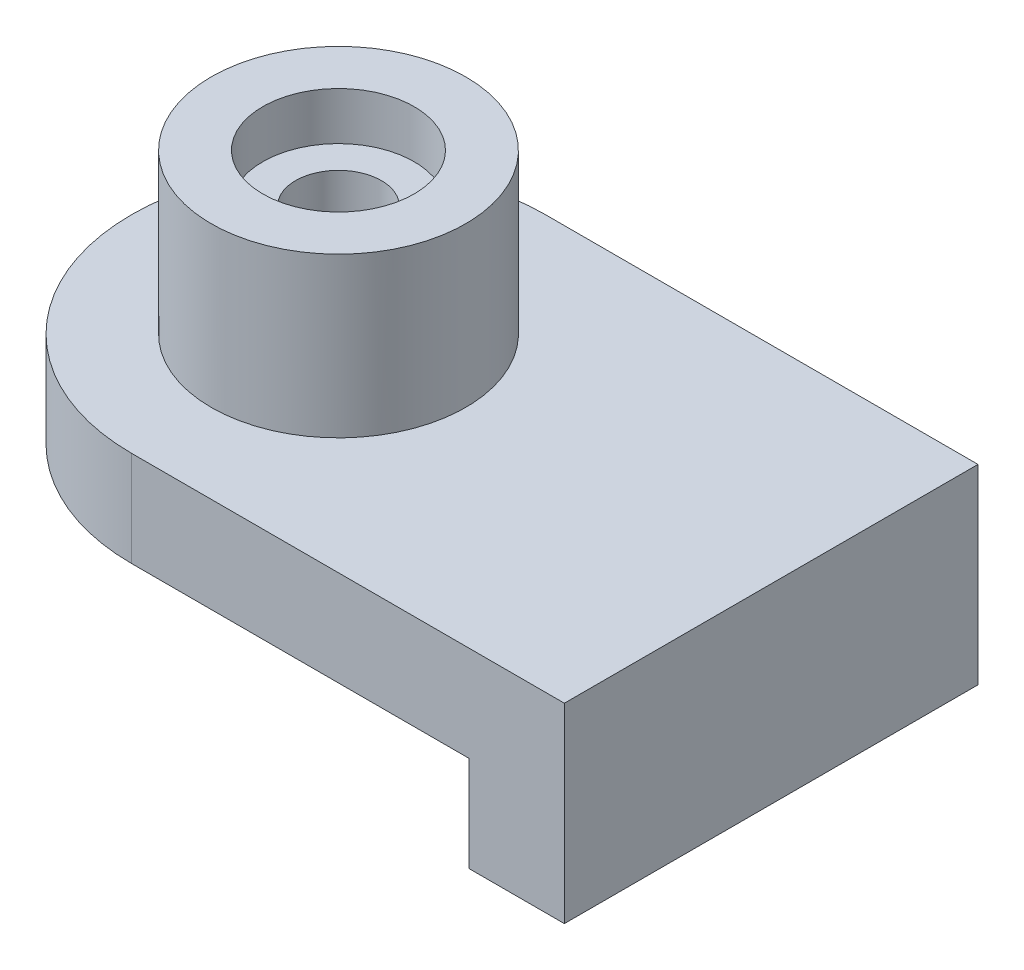
ISO-10303-21;
HEADER;
FILE_DESCRIPTION(('STEP AP214'),'2;1');
FILE_NAME('part.step','',(''),(''),'','','');
FILE_SCHEMA(('AUTOMOTIVE_DESIGN { 1 0 10303 214 1 1 1 1 }'));
ENDSEC;
DATA;
#1=APPLICATION_CONTEXT('core data for automotive mechanical design processes');
#2=APPLICATION_PROTOCOL_DEFINITION('international standard','automotive_design',2000,#1);
#3=PRODUCT_CONTEXT('',#1,'mechanical');
#4=PRODUCT('Part','Part','',(#3));
#5=PRODUCT_RELATED_PRODUCT_CATEGORY('part','',(#4));
#6=PRODUCT_DEFINITION_FORMATION('','',#4);
#7=PRODUCT_DEFINITION_CONTEXT('part definition',#1,'design');
#8=PRODUCT_DEFINITION('design','',#6,#7);
#9=PRODUCT_DEFINITION_SHAPE('','',#8);
#10=(LENGTH_UNIT() NAMED_UNIT(*) SI_UNIT(.MILLI.,.METRE.));
#11=(NAMED_UNIT(*) PLANE_ANGLE_UNIT() SI_UNIT($,.RADIAN.));
#12=(NAMED_UNIT(*) SI_UNIT($,.STERADIAN.) SOLID_ANGLE_UNIT());
#13=UNCERTAINTY_MEASURE_WITH_UNIT(LENGTH_MEASURE(1.E-05),#10,'distance_accuracy_value','');
#14=(GEOMETRIC_REPRESENTATION_CONTEXT(3) GLOBAL_UNCERTAINTY_ASSIGNED_CONTEXT((#13)) GLOBAL_UNIT_ASSIGNED_CONTEXT((#10,
#11,#12)) REPRESENTATION_CONTEXT('',''));
#15=CARTESIAN_POINT('',(0.,0.,0.));
#16=DIRECTION('',(0.,0.,1.));
#17=DIRECTION('',(1.,0.,0.));
#18=AXIS2_PLACEMENT_3D('',#15,#16,#17);
#19=CARTESIAN_POINT('',(53.,0.,65.));
#20=DIRECTION('',(0.,1.,0.));
#21=DIRECTION('',(-1.,0.,0.));
#22=AXIS2_PLACEMENT_3D('',#19,#20,#21);
#23=PLANE('',#22);
#24=CARTESIAN_POINT('',(0.,0.,32.5));
#25=DIRECTION('',(0.,1.,0.));
#26=DIRECTION('',(-1.,0.,0.));
#27=AXIS2_PLACEMENT_3D('',#24,#25,#26);
#28=CIRCLE('',#27,6.749999962);
#29=CARTESIAN_POINT('',(-6.749999962,0.,32.5));
#30=VERTEX_POINT('',#29);
#31=EDGE_CURVE('E151',#30,#30,#28,.T.);
#32=ORIENTED_EDGE('',*,*,#31,.T.);
#33=EDGE_LOOP('',(#32));
#34=FACE_BOUND('',#33,.T.);
#35=DIRECTION('',(1.,0.,0.));
#36=VECTOR('',#35,1.);
#37=CARTESIAN_POINT('',(53.,0.,65.));
#38=LINE('',#37,#36);
#39=CARTESIAN_POINT('',(0.,0.,65.));
#40=VERTEX_POINT('',#39);
#41=CARTESIAN_POINT('',(53.,0.,65.));
#42=VERTEX_POINT('',#41);
#43=EDGE_CURVE('E131',#40,#42,#38,.T.);
#44=ORIENTED_EDGE('',*,*,#43,.F.);
#45=CARTESIAN_POINT('',(0.,0.,32.5));
#46=DIRECTION('',(0.,1.,0.));
#47=DIRECTION('',(0.,0.,1.));
#48=AXIS2_PLACEMENT_3D('',#45,#46,#47);
#49=CIRCLE('',#48,32.5);
#50=CARTESIAN_POINT('',(0.,0.,0.));
#51=VERTEX_POINT('',#50);
#52=EDGE_CURVE('E123',#51,#40,#49,.T.);
#53=ORIENTED_EDGE('',*,*,#52,.F.);
#54=DIRECTION('',(1.,0.,0.));
#55=VECTOR('',#54,1.);
#56=CARTESIAN_POINT('',(53.,0.,0.));
#57=LINE('',#56,#55);
#58=CARTESIAN_POINT('',(53.,0.,0.));
#59=VERTEX_POINT('',#58);
#60=EDGE_CURVE('E119',#51,#59,#57,.T.);
#61=ORIENTED_EDGE('',*,*,#60,.T.);
#62=DIRECTION('',(0.,0.,-1.));
#63=VECTOR('',#62,1.);
#64=CARTESIAN_POINT('',(53.,0.,65.));
#65=LINE('',#64,#63);
#66=EDGE_CURVE('E47',#42,#59,#65,.T.);
#67=ORIENTED_EDGE('',*,*,#66,.F.);
#68=EDGE_LOOP('',(#44,#53,#61,#67));
#69=FACE_BOUND('',#68,.T.);
#70=ADVANCED_FACE('F39',(#34,#69),#23,.F.);
#71=CARTESIAN_POINT('',(53.,-15.,65.));
#72=DIRECTION('',(1.,0.,0.));
#73=DIRECTION('',(0.,0.,-1.));
#74=AXIS2_PLACEMENT_3D('',#71,#72,#73);
#75=PLANE('',#74);
#76=DIRECTION('',(0.,-1.,0.));
#77=VECTOR('',#76,1.);
#78=CARTESIAN_POINT('',(53.,-15.,0.));
#79=LINE('',#78,#77);
#80=CARTESIAN_POINT('',(53.,-15.,0.));
#81=VERTEX_POINT('',#80);
#82=EDGE_CURVE('E122',#59,#81,#79,.T.);
#83=ORIENTED_EDGE('',*,*,#82,.T.);
#84=DIRECTION('',(0.,0.,-1.));
#85=VECTOR('',#84,1.);
#86=CARTESIAN_POINT('',(53.,-15.,65.));
#87=LINE('',#86,#85);
#88=CARTESIAN_POINT('',(53.,-15.,65.));
#89=VERTEX_POINT('',#88);
#90=EDGE_CURVE('E134',#89,#81,#87,.T.);
#91=ORIENTED_EDGE('',*,*,#90,.F.);
#92=DIRECTION('',(0.,-1.,0.));
#93=VECTOR('',#92,1.);
#94=CARTESIAN_POINT('',(53.,-15.,65.));
#95=LINE('',#94,#93);
#96=EDGE_CURVE('E92',#42,#89,#95,.T.);
#97=ORIENTED_EDGE('',*,*,#96,.F.);
#98=ORIENTED_EDGE('',*,*,#66,.T.);
#99=EDGE_LOOP('',(#83,#91,#97,#98));
#100=FACE_BOUND('',#99,.T.);
#101=ADVANCED_FACE('F137',(#100),#75,.F.);
#102=CARTESIAN_POINT('',(68.,-15.,65.));
#103=DIRECTION('',(0.,1.,0.));
#104=DIRECTION('',(-1.,0.,0.));
#105=AXIS2_PLACEMENT_3D('',#102,#103,#104);
#106=PLANE('',#105);
#107=DIRECTION('',(1.,0.,0.));
#108=VECTOR('',#107,1.);
#109=CARTESIAN_POINT('',(68.,-15.,0.));
#110=LINE('',#109,#108);
#111=CARTESIAN_POINT('',(68.,-15.,0.));
#112=VERTEX_POINT('',#111);
#113=EDGE_CURVE('E125',#81,#112,#110,.T.);
#114=ORIENTED_EDGE('',*,*,#113,.T.);
#115=DIRECTION('',(0.,0.,-1.));
#116=VECTOR('',#115,1.);
#117=CARTESIAN_POINT('',(68.,-15.,65.));
#118=LINE('',#117,#116);
#119=CARTESIAN_POINT('',(68.,-15.,65.));
#120=VERTEX_POINT('',#119);
#121=EDGE_CURVE('E110',#120,#112,#118,.T.);
#122=ORIENTED_EDGE('',*,*,#121,.F.);
#123=DIRECTION('',(1.,0.,0.));
#124=VECTOR('',#123,1.);
#125=CARTESIAN_POINT('',(68.,-15.,65.));
#126=LINE('',#125,#124);
#127=EDGE_CURVE('E105',#89,#120,#126,.T.);
#128=ORIENTED_EDGE('',*,*,#127,.F.);
#129=ORIENTED_EDGE('',*,*,#90,.T.);
#130=EDGE_LOOP('',(#114,#122,#128,#129));
#131=FACE_BOUND('',#130,.T.);
#132=ADVANCED_FACE('F156',(#131),#106,.F.);
#133=CARTESIAN_POINT('',(68.,15.,65.));
#134=DIRECTION('',(-1.,0.,0.));
#135=DIRECTION('',(0.,0.,1.));
#136=AXIS2_PLACEMENT_3D('',#133,#134,#135);
#137=PLANE('',#136);
#138=DIRECTION('',(0.,1.,0.));
#139=VECTOR('',#138,1.);
#140=CARTESIAN_POINT('',(68.,15.,0.));
#141=LINE('',#140,#139);
#142=CARTESIAN_POINT('',(68.,15.,0.));
#143=VERTEX_POINT('',#142);
#144=EDGE_CURVE('E76',#112,#143,#141,.T.);
#145=ORIENTED_EDGE('',*,*,#144,.T.);
#146=DIRECTION('',(0.,0.,-1.));
#147=VECTOR('',#146,1.);
#148=CARTESIAN_POINT('',(68.,15.,65.));
#149=LINE('',#148,#147);
#150=CARTESIAN_POINT('',(68.,15.,65.));
#151=VERTEX_POINT('',#150);
#152=EDGE_CURVE('E108',#151,#143,#149,.T.);
#153=ORIENTED_EDGE('',*,*,#152,.F.);
#154=DIRECTION('',(0.,1.,0.));
#155=VECTOR('',#154,1.);
#156=CARTESIAN_POINT('',(68.,15.,65.));
#157=LINE('',#156,#155);
#158=EDGE_CURVE('E100',#120,#151,#157,.T.);
#159=ORIENTED_EDGE('',*,*,#158,.F.);
#160=ORIENTED_EDGE('',*,*,#121,.T.);
#161=EDGE_LOOP('',(#145,#153,#159,#160));
#162=FACE_BOUND('',#161,.T.);
#163=ADVANCED_FACE('F109',(#162),#137,.F.);
#164=CARTESIAN_POINT('',(0.,15.,65.));
#165=DIRECTION('',(0.,-1.,0.));
#166=DIRECTION('',(0.,0.,-1.));
#167=AXIS2_PLACEMENT_3D('',#164,#165,#166);
#168=PLANE('',#167);
#169=CARTESIAN_POINT('',(0.,15.,32.5));
#170=DIRECTION('',(0.,-1.,0.));
#171=DIRECTION('',(0.,0.,-1.));
#172=AXIS2_PLACEMENT_3D('',#169,#170,#171);
#173=CIRCLE('',#172,20.);
#174=CARTESIAN_POINT('',(0.,15.,12.5));
#175=VERTEX_POINT('',#174);
#176=EDGE_CURVE('E12',#175,#175,#173,.F.);
#177=ORIENTED_EDGE('',*,*,#176,.F.);
#178=EDGE_LOOP('',(#177));
#179=FACE_BOUND('',#178,.T.);
#180=DIRECTION('',(-1.,0.,0.));
#181=VECTOR('',#180,1.);
#182=CARTESIAN_POINT('',(0.,15.,0.));
#183=LINE('',#182,#181);
#184=CARTESIAN_POINT('',(0.,15.,0.));
#185=VERTEX_POINT('',#184);
#186=EDGE_CURVE('E83',#143,#185,#183,.T.);
#187=ORIENTED_EDGE('',*,*,#186,.T.);
#188=CARTESIAN_POINT('',(0.,15.,32.5));
#189=DIRECTION('',(0.,1.,0.));
#190=DIRECTION('',(0.,0.,1.));
#191=AXIS2_PLACEMENT_3D('',#188,#189,#190);
#192=CIRCLE('',#191,32.5);
#193=CARTESIAN_POINT('',(0.,15.,65.));
#194=VERTEX_POINT('',#193);
#195=EDGE_CURVE('E114',#185,#194,#192,.T.);
#196=ORIENTED_EDGE('',*,*,#195,.T.);
#197=DIRECTION('',(-1.,0.,0.));
#198=VECTOR('',#197,1.);
#199=CARTESIAN_POINT('',(0.,15.,65.));
#200=LINE('',#199,#198);
#201=EDGE_CURVE('E103',#151,#194,#200,.T.);
#202=ORIENTED_EDGE('',*,*,#201,.F.);
#203=ORIENTED_EDGE('',*,*,#152,.T.);
#204=EDGE_LOOP('',(#187,#196,#202,#203));
#205=FACE_BOUND('',#204,.T.);
#206=ADVANCED_FACE('F112',(#179,#205),#168,.F.);
#207=CARTESIAN_POINT('',(0.,0.,65.));
#208=DIRECTION('',(0.,0.,-1.));
#209=DIRECTION('',(-1.,0.,0.));
#210=AXIS2_PLACEMENT_3D('',#207,#208,#209);
#211=PLANE('',#210);
#212=ORIENTED_EDGE('',*,*,#43,.T.);
#213=ORIENTED_EDGE('',*,*,#96,.T.);
#214=ORIENTED_EDGE('',*,*,#127,.T.);
#215=ORIENTED_EDGE('',*,*,#158,.T.);
#216=ORIENTED_EDGE('',*,*,#201,.T.);
#217=DIRECTION('',(0.,-1.,0.));
#218=VECTOR('',#217,1.);
#219=CARTESIAN_POINT('',(0.,0.,65.));
#220=LINE('',#219,#218);
#221=EDGE_CURVE('E55',#194,#40,#220,.T.);
#222=ORIENTED_EDGE('',*,*,#221,.T.);
#223=EDGE_LOOP('',(#212,#213,#214,#215,#216,#222));
#224=FACE_BOUND('',#223,.T.);
#225=ADVANCED_FACE('F101',(#224),#211,.F.);
#226=CARTESIAN_POINT('',(0.,0.,0.));
#227=DIRECTION('',(0.,0.,-1.));
#228=DIRECTION('',(-1.,0.,0.));
#229=AXIS2_PLACEMENT_3D('',#226,#227,#228);
#230=PLANE('',#229);
#231=ORIENTED_EDGE('',*,*,#60,.F.);
#232=DIRECTION('',(0.,-1.,0.));
#233=VECTOR('',#232,1.);
#234=CARTESIAN_POINT('',(0.,0.,0.));
#235=LINE('',#234,#233);
#236=EDGE_CURVE('E129',#185,#51,#235,.T.);
#237=ORIENTED_EDGE('',*,*,#236,.F.);
#238=ORIENTED_EDGE('',*,*,#186,.F.);
#239=ORIENTED_EDGE('',*,*,#144,.F.);
#240=ORIENTED_EDGE('',*,*,#113,.F.);
#241=ORIENTED_EDGE('',*,*,#82,.F.);
#242=EDGE_LOOP('',(#231,#237,#238,#239,#240,#241));
#243=FACE_BOUND('',#242,.T.);
#244=ADVANCED_FACE('F143',(#243),#230,.T.);
#245=CARTESIAN_POINT('',(0.,0.,32.5));
#246=DIRECTION('',(0.,1.,0.));
#247=DIRECTION('',(0.,0.,1.));
#248=AXIS2_PLACEMENT_3D('',#245,#246,#247);
#249=CYLINDRICAL_SURFACE('',#248,32.5);
#250=ORIENTED_EDGE('',*,*,#52,.T.);
#251=ORIENTED_EDGE('',*,*,#221,.F.);
#252=ORIENTED_EDGE('',*,*,#195,.F.);
#253=ORIENTED_EDGE('',*,*,#236,.T.);
#254=EDGE_LOOP('',(#250,#251,#252,#253));
#255=FACE_BOUND('',#254,.T.);
#256=ADVANCED_FACE('F146',(#255),#249,.T.);
#257=CARTESIAN_POINT('',(0.,151.568542494924,32.5));
#258=DIRECTION('',(0.,-1.,0.));
#259=DIRECTION('',(0.,0.,-1.));
#260=AXIS2_PLACEMENT_3D('',#257,#258,#259);
#261=CYLINDRICAL_SURFACE('',#260,20.);
#262=ORIENTED_EDGE('',*,*,#176,.T.);
#263=EDGE_LOOP('',(#262));
#264=FACE_BOUND('',#263,.T.);
#265=CARTESIAN_POINT('',(0.,40.,32.5));
#266=DIRECTION('',(0.,1.,0.));
#267=DIRECTION('',(-1.,0.,0.));
#268=AXIS2_PLACEMENT_3D('',#265,#266,#267);
#269=CIRCLE('',#268,20.);
#270=CARTESIAN_POINT('',(-20.,40.,32.5));
#271=VERTEX_POINT('',#270);
#272=EDGE_CURVE('E147',#271,#271,#269,.T.);
#273=ORIENTED_EDGE('',*,*,#272,.F.);
#274=EDGE_LOOP('',(#273));
#275=FACE_BOUND('',#274,.T.);
#276=ADVANCED_FACE('F189',(#264,#275),#261,.T.);
#277=CARTESIAN_POINT('',(68.,40.,65.));
#278=DIRECTION('',(0.,1.,0.));
#279=DIRECTION('',(-1.,0.,0.));
#280=AXIS2_PLACEMENT_3D('',#277,#278,#279);
#281=PLANE('',#280);
#282=CARTESIAN_POINT('',(0.,40.,32.5));
#283=DIRECTION('',(0.,1.,0.));
#284=DIRECTION('',(0.,0.,1.));
#285=AXIS2_PLACEMENT_3D('',#282,#283,#284);
#286=CIRCLE('',#285,11.894999959);
#287=CARTESIAN_POINT('',(0.,40.,44.394999959));
#288=VERTEX_POINT('',#287);
#289=EDGE_CURVE('E179',#288,#288,#286,.T.);
#290=ORIENTED_EDGE('',*,*,#289,.F.);
#291=EDGE_LOOP('',(#290));
#292=FACE_BOUND('',#291,.T.);
#293=ORIENTED_EDGE('',*,*,#272,.T.);
#294=EDGE_LOOP('',(#293));
#295=FACE_BOUND('',#294,.T.);
#296=ADVANCED_FACE('F185',(#292,#295),#281,.T.);
#297=CARTESIAN_POINT('',(0.,40.,32.5));
#298=DIRECTION('',(0.,1.,0.));
#299=DIRECTION('',(0.,0.,1.));
#300=AXIS2_PLACEMENT_3D('',#297,#298,#299);
#301=CYLINDRICAL_SURFACE('',#300,6.749999962);
#302=ORIENTED_EDGE('',*,*,#31,.F.);
#303=EDGE_LOOP('',(#302));
#304=FACE_BOUND('',#303,.T.);
#305=CARTESIAN_POINT('',(0.,32.500000014,32.5));
#306=DIRECTION('',(0.,1.,0.));
#307=DIRECTION('',(0.,0.,1.));
#308=AXIS2_PLACEMENT_3D('',#305,#306,#307);
#309=CIRCLE('',#308,6.749999962);
#310=CARTESIAN_POINT('',(0.,32.500000014,39.249999962));
#311=VERTEX_POINT('',#310);
#312=EDGE_CURVE('E171',#311,#311,#309,.T.);
#313=ORIENTED_EDGE('',*,*,#312,.T.);
#314=EDGE_LOOP('',(#313));
#315=FACE_BOUND('',#314,.T.);
#316=ADVANCED_FACE('F188',(#304,#315),#301,.F.);
#317=CARTESIAN_POINT('',(6.749999962,32.500000014,32.5));
#318=DIRECTION('',(0.,-1.,0.));
#319=DIRECTION('',(0.,0.,-1.));
#320=AXIS2_PLACEMENT_3D('',#317,#318,#319);
#321=PLANE('',#320);
#322=ORIENTED_EDGE('',*,*,#312,.F.);
#323=EDGE_LOOP('',(#322));
#324=FACE_BOUND('',#323,.T.);
#325=CARTESIAN_POINT('',(0.,32.500000014,32.5));
#326=DIRECTION('',(0.,1.,0.));
#327=DIRECTION('',(0.,0.,1.));
#328=AXIS2_PLACEMENT_3D('',#325,#326,#327);
#329=CIRCLE('',#328,11.894999959);
#330=CARTESIAN_POINT('',(0.,32.500000014,44.394999959));
#331=VERTEX_POINT('',#330);
#332=EDGE_CURVE('E174',#331,#331,#329,.T.);
#333=ORIENTED_EDGE('',*,*,#332,.T.);
#334=EDGE_LOOP('',(#333));
#335=FACE_BOUND('',#334,.T.);
#336=ADVANCED_FACE('F257',(#324,#335),#321,.F.);
#337=CARTESIAN_POINT('',(0.,40.,32.5));
#338=DIRECTION('',(0.,1.,0.));
#339=DIRECTION('',(0.,0.,1.));
#340=AXIS2_PLACEMENT_3D('',#337,#338,#339);
#341=CYLINDRICAL_SURFACE('',#340,11.894999959);
#342=ORIENTED_EDGE('',*,*,#332,.F.);
#343=EDGE_LOOP('',(#342));
#344=FACE_BOUND('',#343,.T.);
#345=ORIENTED_EDGE('',*,*,#289,.T.);
#346=EDGE_LOOP('',(#345));
#347=FACE_BOUND('',#346,.T.);
#348=ADVANCED_FACE('F183',(#344,#347),#341,.F.);
#349=CLOSED_SHELL('',(#70,#101,#132,#163,#206,#225,#244,#256,#276,#296,#316,#336,#348));
#350=MANIFOLD_SOLID_BREP('B2',#349);
#351=ADVANCED_BREP_SHAPE_REPRESENTATION('',(#18,#350),#14);
#352=SHAPE_DEFINITION_REPRESENTATION(#9,#351);
ENDSEC;
END-ISO-10303-21;
